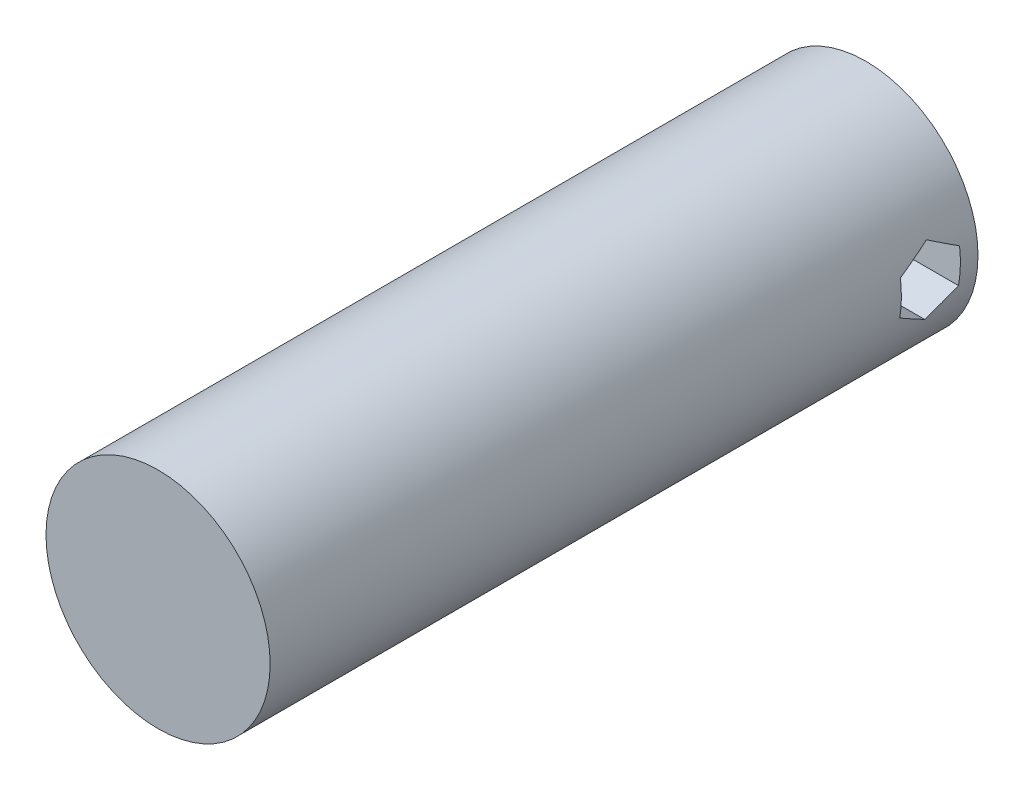
ISO-10303-21;
HEADER;
FILE_DESCRIPTION(('STEP AP214'),'2;1');
FILE_NAME('part.step','',(''),(''),'','','');
FILE_SCHEMA(('AUTOMOTIVE_DESIGN { 1 0 10303 214 1 1 1 1 }'));
ENDSEC;
DATA;
#1=APPLICATION_CONTEXT('core data for automotive mechanical design processes');
#2=APPLICATION_PROTOCOL_DEFINITION('international standard','automotive_design',2000,#1);
#3=PRODUCT_CONTEXT('',#1,'mechanical');
#4=PRODUCT('Part','Part','',(#3));
#5=PRODUCT_RELATED_PRODUCT_CATEGORY('part','',(#4));
#6=PRODUCT_DEFINITION_FORMATION('','',#4);
#7=PRODUCT_DEFINITION_CONTEXT('part definition',#1,'design');
#8=PRODUCT_DEFINITION('design','',#6,#7);
#9=PRODUCT_DEFINITION_SHAPE('','',#8);
#10=(LENGTH_UNIT() NAMED_UNIT(*) SI_UNIT(.MILLI.,.METRE.));
#11=(NAMED_UNIT(*) PLANE_ANGLE_UNIT() SI_UNIT($,.RADIAN.));
#12=(NAMED_UNIT(*) SI_UNIT($,.STERADIAN.) SOLID_ANGLE_UNIT());
#13=UNCERTAINTY_MEASURE_WITH_UNIT(LENGTH_MEASURE(1.E-05),#10,'distance_accuracy_value','');
#14=(GEOMETRIC_REPRESENTATION_CONTEXT(3) GLOBAL_UNCERTAINTY_ASSIGNED_CONTEXT((#13)) GLOBAL_UNIT_ASSIGNED_CONTEXT((#10,
#11,#12)) REPRESENTATION_CONTEXT('',''));
#15=CARTESIAN_POINT('',(0.,0.,0.));
#16=DIRECTION('',(0.,0.,1.));
#17=DIRECTION('',(1.,0.,0.));
#18=AXIS2_PLACEMENT_3D('',#15,#16,#17);
#19=CARTESIAN_POINT('',(0.,0.,30.));
#20=DIRECTION('',(0.,0.,-1.));
#21=DIRECTION('',(-1.,0.,0.));
#22=AXIS2_PLACEMENT_3D('',#19,#20,#21);
#23=CYLINDRICAL_SURFACE('',#22,4.75);
#24=CARTESIAN_POINT('',(0.,0.,-0.39249852163227));
#25=DIRECTION('',(0.,0.852659897031217,-0.522466362548552));
#26=DIRECTION('',(0.,-0.522466362548552,-0.852659897031217));
#27=AXIS2_PLACEMENT_3D('',#24,#25,#26);
#28=ELLIPSE('',#27,9.09149438220263,4.75);
#29=CARTESIAN_POINT('',(4.52554859875823,1.44288249011393,1.96227132316203));
#30=VERTEX_POINT('',#29);
#31=CARTESIAN_POINT('',(4.69979783309166,0.688767252464107,0.731562770466596));
#32=VERTEX_POINT('',#31);
#33=EDGE_CURVE('E108',#30,#32,#28,.T.);
#34=ORIENTED_EDGE('',*,*,#33,.T.);
#35=CARTESIAN_POINT('',(0.,0.,0.749572745126933));
#36=DIRECTION('',(0.,-0.0261391940742877,-0.999658312891533));
#37=DIRECTION('',(0.,0.999658312891534,-0.0261391940742877));
#38=AXIS2_PLACEMENT_3D('',#35,#36,#37);
#39=ELLIPSE('',#38,4.75162356851765,4.75);
#40=CARTESIAN_POINT('',(4.6897558793976,-0.754115237649827,0.769291447304571));
#41=VERTEX_POINT('',#40);
#42=EDGE_CURVE('E144',#32,#41,#39,.T.);
#43=ORIENTED_EDGE('',*,*,#42,.T.);
#44=CARTESIAN_POINT('',(0.,0.,-0.61949095977324));
#45=DIRECTION('',(0.,-0.878799091105505,-0.477191950342982));
#46=DIRECTION('',(0.,0.477191950342982,-0.878799091105505));
#47=AXIS2_PLACEMENT_3D('',#44,#45,#46);
#48=ELLIPSE('',#47,9.9540656471383,4.75);
#49=CARTESIAN_POINT('',(4.52554859875823,-1.44288249011393,2.03772867683797));
#50=VERTEX_POINT('',#49);
#51=EDGE_CURVE('E146',#41,#50,#48,.T.);
#52=ORIENTED_EDGE('',*,*,#51,.T.);
#53=CARTESIAN_POINT('',(0.,0.,4.39249852163227));
#54=DIRECTION('',(0.,-0.852659897031217,0.522466362548552));
#55=DIRECTION('',(0.,-0.522466362548552,-0.852659897031217));
#56=AXIS2_PLACEMENT_3D('',#53,#54,#55);
#57=ELLIPSE('',#56,9.09149438220263,4.75);
#58=CARTESIAN_POINT('',(4.69979783309166,-0.688767252464107,3.2684372295334));
#59=VERTEX_POINT('',#58);
#60=EDGE_CURVE('E149',#50,#59,#57,.T.);
#61=ORIENTED_EDGE('',*,*,#60,.T.);
#62=CARTESIAN_POINT('',(0.,0.,3.25042725487307));
#63=DIRECTION('',(0.,0.0261391940742878,0.999658312891533));
#64=DIRECTION('',(0.,0.999658312891533,-0.0261391940742878));
#65=AXIS2_PLACEMENT_3D('',#62,#63,#64);
#66=ELLIPSE('',#65,4.75162356851765,4.75);
#67=CARTESIAN_POINT('',(4.6897558793976,0.754115237649827,3.23070855269543));
#68=VERTEX_POINT('',#67);
#69=EDGE_CURVE('E152',#59,#68,#66,.T.);
#70=ORIENTED_EDGE('',*,*,#69,.T.);
#71=CARTESIAN_POINT('',(0.,0.,4.61949095977324));
#72=DIRECTION('',(0.,0.878799091105505,0.477191950342982));
#73=DIRECTION('',(0.,0.477191950342982,-0.878799091105505));
#74=AXIS2_PLACEMENT_3D('',#71,#72,#73);
#75=ELLIPSE('',#74,9.9540656471383,4.75);
#76=EDGE_CURVE('E135',#68,#30,#75,.T.);
#77=ORIENTED_EDGE('',*,*,#76,.T.);
#78=EDGE_LOOP('',(#34,#43,#52,#61,#70,#77));
#79=FACE_BOUND('',#78,.T.);
#80=CARTESIAN_POINT('',(0.,0.,30.));
#81=DIRECTION('',(0.,0.,1.));
#82=DIRECTION('',(1.,0.,0.));
#83=AXIS2_PLACEMENT_3D('',#80,#81,#82);
#84=CIRCLE('',#83,4.75);
#85=CARTESIAN_POINT('',(4.75,0.,30.));
#86=VERTEX_POINT('',#85);
#87=EDGE_CURVE('E11',#86,#86,#84,.T.);
#88=ORIENTED_EDGE('',*,*,#87,.F.);
#89=EDGE_LOOP('',(#88));
#90=FACE_BOUND('',#89,.T.);
#91=CARTESIAN_POINT('',(0.,0.,0.));
#92=DIRECTION('',(0.,0.,1.));
#93=DIRECTION('',(1.,0.,0.));
#94=AXIS2_PLACEMENT_3D('',#91,#92,#93);
#95=CIRCLE('',#94,4.75);
#96=CARTESIAN_POINT('',(4.75,0.,0.));
#97=VERTEX_POINT('',#96);
#98=EDGE_CURVE('E40',#97,#97,#95,.T.);
#99=ORIENTED_EDGE('',*,*,#98,.T.);
#100=EDGE_LOOP('',(#99));
#101=FACE_BOUND('',#100,.T.);
#102=ADVANCED_FACE('F37',(#79,#90,#101),#23,.T.);
#103=CARTESIAN_POINT('',(0.,0.,30.));
#104=DIRECTION('',(0.,0.,1.));
#105=DIRECTION('',(1.,0.,0.));
#106=AXIS2_PLACEMENT_3D('',#103,#104,#105);
#107=PLANE('',#106);
#108=ORIENTED_EDGE('',*,*,#87,.T.);
#109=EDGE_LOOP('',(#108));
#110=FACE_BOUND('',#109,.T.);
#111=ADVANCED_FACE('F191',(#110),#107,.T.);
#112=CARTESIAN_POINT('',(0.,0.,0.));
#113=DIRECTION('',(0.,0.,1.));
#114=DIRECTION('',(1.,0.,0.));
#115=AXIS2_PLACEMENT_3D('',#112,#113,#114);
#116=PLANE('',#115);
#117=DIRECTION('',(0.,-1.,0.));
#118=VECTOR('',#117,1.);
#119=CARTESIAN_POINT('',(0.94,1.53505700219894,0.));
#120=LINE('',#119,#118);
#121=CARTESIAN_POINT('',(0.94,1.53505700219894,0.));
#122=VERTEX_POINT('',#121);
#123=CARTESIAN_POINT('',(0.94,-1.53505700219894,0.));
#124=VERTEX_POINT('',#123);
#125=EDGE_CURVE('E159',#122,#124,#120,.T.);
#126=ORIENTED_EDGE('',*,*,#125,.F.);
#127=CARTESIAN_POINT('',(0.,0.,0.));
#128=DIRECTION('',(0.,0.,-1.));
#129=DIRECTION('',(-1.,0.,0.));
#130=AXIS2_PLACEMENT_3D('',#127,#128,#129);
#131=CIRCLE('',#130,1.8);
#132=EDGE_CURVE('E154',#124,#122,#131,.T.);
#133=ORIENTED_EDGE('',*,*,#132,.F.);
#134=EDGE_LOOP('',(#126,#133));
#135=FACE_BOUND('',#134,.T.);
#136=ORIENTED_EDGE('',*,*,#98,.F.);
#137=EDGE_LOOP('',(#136));
#138=FACE_BOUND('',#137,.T.);
#139=ADVANCED_FACE('F175',(#135,#138),#116,.F.);
#140=CARTESIAN_POINT('',(0.,0.,10.));
#141=DIRECTION('',(0.,0.,-1.));
#142=DIRECTION('',(-1.,0.,0.));
#143=AXIS2_PLACEMENT_3D('',#140,#141,#142);
#144=CYLINDRICAL_SURFACE('',#143,1.8);
#145=ORIENTED_EDGE('',*,*,#132,.T.);
#146=DIRECTION('',(0.,0.,-1.));
#147=VECTOR('',#146,1.);
#148=CARTESIAN_POINT('',(0.94,1.53505700219894,10.));
#149=LINE('',#148,#147);
#150=CARTESIAN_POINT('',(0.94,1.53505700219894,10.));
#151=VERTEX_POINT('',#150);
#152=EDGE_CURVE('E162',#151,#122,#149,.T.);
#153=ORIENTED_EDGE('',*,*,#152,.F.);
#154=CARTESIAN_POINT('',(0.,0.,10.));
#155=DIRECTION('',(0.,0.,-1.));
#156=DIRECTION('',(-1.,0.,0.));
#157=AXIS2_PLACEMENT_3D('',#154,#155,#156);
#158=CIRCLE('',#157,1.8);
#159=CARTESIAN_POINT('',(0.94,-1.53505700219894,10.));
#160=VERTEX_POINT('',#159);
#161=EDGE_CURVE('E155',#160,#151,#158,.T.);
#162=ORIENTED_EDGE('',*,*,#161,.F.);
#163=DIRECTION('',(0.,0.,-1.));
#164=VECTOR('',#163,1.);
#165=CARTESIAN_POINT('',(0.94,-1.53505700219894,10.));
#166=LINE('',#165,#164);
#167=EDGE_CURVE('E166',#160,#124,#166,.T.);
#168=ORIENTED_EDGE('',*,*,#167,.T.);
#169=EDGE_LOOP('',(#145,#153,#162,#168));
#170=FACE_BOUND('',#169,.T.);
#171=ADVANCED_FACE('F177',(#170),#144,.F.);
#172=CARTESIAN_POINT('',(0.94,1.53505700219894,10.));
#173=DIRECTION('',(1.,0.,0.));
#174=DIRECTION('',(0.,0.,-1.));
#175=AXIS2_PLACEMENT_3D('',#172,#173,#174);
#176=PLANE('',#175);
#177=DIRECTION('',(0.,0.477191950342982,-0.878799091105505));
#178=VECTOR('',#177,1.);
#179=CARTESIAN_POINT('',(0.94,0.754115237649827,3.23070855269543));
#180=LINE('',#179,#178);
#181=CARTESIAN_POINT('',(0.94,0.754115237649827,3.23070855269543));
#182=VERTEX_POINT('',#181);
#183=CARTESIAN_POINT('',(0.94,1.44288249011393,1.96227132316203));
#184=VERTEX_POINT('',#183);
#185=EDGE_CURVE('E114',#182,#184,#180,.T.);
#186=ORIENTED_EDGE('',*,*,#185,.F.);
#187=DIRECTION('',(0.,0.999658312891533,-0.0261391940742878));
#188=VECTOR('',#187,1.);
#189=CARTESIAN_POINT('',(0.94,-0.688767252464107,3.2684372295334));
#190=LINE('',#189,#188);
#191=CARTESIAN_POINT('',(0.94,-0.688767252464107,3.2684372295334));
#192=VERTEX_POINT('',#191);
#193=EDGE_CURVE('E59',#192,#182,#190,.T.);
#194=ORIENTED_EDGE('',*,*,#193,.F.);
#195=DIRECTION('',(0.,0.522466362548552,0.852659897031217));
#196=VECTOR('',#195,1.);
#197=CARTESIAN_POINT('',(0.94,-1.44288249011393,2.03772867683797));
#198=LINE('',#197,#196);
#199=CARTESIAN_POINT('',(0.94,-1.44288249011393,2.03772867683797));
#200=VERTEX_POINT('',#199);
#201=EDGE_CURVE('E130',#200,#192,#198,.T.);
#202=ORIENTED_EDGE('',*,*,#201,.F.);
#203=DIRECTION('',(0.,-0.477191950342982,0.878799091105505));
#204=VECTOR('',#203,1.);
#205=CARTESIAN_POINT('',(0.94,-0.754115237649827,0.769291447304571));
#206=LINE('',#205,#204);
#207=CARTESIAN_POINT('',(0.94,-0.754115237649827,0.769291447304571));
#208=VERTEX_POINT('',#207);
#209=EDGE_CURVE('E124',#208,#200,#206,.T.);
#210=ORIENTED_EDGE('',*,*,#209,.F.);
#211=DIRECTION('',(0.,-0.999658312891533,0.0261391940742877));
#212=VECTOR('',#211,1.);
#213=CARTESIAN_POINT('',(0.94,0.688767252464107,0.731562770466596));
#214=LINE('',#213,#212);
#215=CARTESIAN_POINT('',(0.94,0.688767252464107,0.731562770466596));
#216=VERTEX_POINT('',#215);
#217=EDGE_CURVE('E122',#216,#208,#214,.T.);
#218=ORIENTED_EDGE('',*,*,#217,.F.);
#219=DIRECTION('',(0.,-0.522466362548552,-0.852659897031217));
#220=VECTOR('',#219,1.);
#221=CARTESIAN_POINT('',(0.94,1.44288249011393,1.96227132316203));
#222=LINE('',#221,#220);
#223=EDGE_CURVE('E105',#184,#216,#222,.T.);
#224=ORIENTED_EDGE('',*,*,#223,.F.);
#225=EDGE_LOOP('',(#186,#194,#202,#210,#218,#224));
#226=FACE_BOUND('',#225,.T.);
#227=ORIENTED_EDGE('',*,*,#125,.T.);
#228=ORIENTED_EDGE('',*,*,#167,.F.);
#229=DIRECTION('',(0.,-1.,0.));
#230=VECTOR('',#229,1.);
#231=CARTESIAN_POINT('',(0.94,1.53505700219894,10.));
#232=LINE('',#231,#230);
#233=EDGE_CURVE('E158',#151,#160,#232,.T.);
#234=ORIENTED_EDGE('',*,*,#233,.F.);
#235=ORIENTED_EDGE('',*,*,#152,.T.);
#236=EDGE_LOOP('',(#227,#228,#234,#235));
#237=FACE_BOUND('',#236,.T.);
#238=ADVANCED_FACE('F118',(#226,#237),#176,.F.);
#239=CARTESIAN_POINT('',(0.,0.,10.));
#240=DIRECTION('',(0.,0.,-1.));
#241=DIRECTION('',(-1.,0.,0.));
#242=AXIS2_PLACEMENT_3D('',#239,#240,#241);
#243=PLANE('',#242);
#244=ORIENTED_EDGE('',*,*,#161,.T.);
#245=ORIENTED_EDGE('',*,*,#233,.T.);
#246=EDGE_LOOP('',(#244,#245));
#247=FACE_BOUND('',#246,.T.);
#248=ADVANCED_FACE('F179',(#247),#243,.T.);
#249=CARTESIAN_POINT('',(4.75,-0.688767252464107,3.2684372295334));
#250=DIRECTION('',(0.,0.0261391940742878,0.999658312891533));
#251=DIRECTION('',(0.,-0.999658312891534,0.0261391940742879));
#252=AXIS2_PLACEMENT_3D('',#249,#250,#251);
#253=PLANE('',#252);
#254=DIRECTION('',(-1.,0.,0.));
#255=VECTOR('',#254,1.);
#256=CARTESIAN_POINT('',(4.75,-0.688767252464107,3.2684372295334));
#257=LINE('',#256,#255);
#258=EDGE_CURVE('E133',#59,#192,#257,.T.);
#259=ORIENTED_EDGE('',*,*,#258,.T.);
#260=ORIENTED_EDGE('',*,*,#193,.T.);
#261=DIRECTION('',(-1.,0.,0.));
#262=VECTOR('',#261,1.);
#263=CARTESIAN_POINT('',(4.75,0.754115237649827,3.23070855269543));
#264=LINE('',#263,#262);
#265=EDGE_CURVE('E111',#68,#182,#264,.T.);
#266=ORIENTED_EDGE('',*,*,#265,.F.);
#267=ORIENTED_EDGE('',*,*,#69,.F.);
#268=EDGE_LOOP('',(#259,#260,#266,#267));
#269=FACE_BOUND('',#268,.T.);
#270=ADVANCED_FACE('F181',(#269),#253,.F.);
#271=CARTESIAN_POINT('',(4.75,-1.44288249011393,2.03772867683797));
#272=DIRECTION('',(0.,-0.852659897031217,0.522466362548552));
#273=DIRECTION('',(0.,-0.522466362548552,-0.852659897031217));
#274=AXIS2_PLACEMENT_3D('',#271,#272,#273);
#275=PLANE('',#274);
#276=DIRECTION('',(-1.,0.,0.));
#277=VECTOR('',#276,1.);
#278=CARTESIAN_POINT('',(4.75,-1.44288249011393,2.03772867683797));
#279=LINE('',#278,#277);
#280=EDGE_CURVE('E136',#50,#200,#279,.T.);
#281=ORIENTED_EDGE('',*,*,#280,.T.);
#282=ORIENTED_EDGE('',*,*,#201,.T.);
#283=ORIENTED_EDGE('',*,*,#258,.F.);
#284=ORIENTED_EDGE('',*,*,#60,.F.);
#285=EDGE_LOOP('',(#281,#282,#283,#284));
#286=FACE_BOUND('',#285,.T.);
#287=ADVANCED_FACE('F187',(#286),#275,.F.);
#288=CARTESIAN_POINT('',(4.75,-0.754115237649827,0.769291447304571));
#289=DIRECTION('',(0.,-0.878799091105505,-0.477191950342982));
#290=DIRECTION('',(0.,0.477191950342982,-0.878799091105505));
#291=AXIS2_PLACEMENT_3D('',#288,#289,#290);
#292=PLANE('',#291);
#293=DIRECTION('',(-1.,0.,0.));
#294=VECTOR('',#293,1.);
#295=CARTESIAN_POINT('',(4.75,-0.754115237649827,0.769291447304571));
#296=LINE('',#295,#294);
#297=EDGE_CURVE('E138',#41,#208,#296,.T.);
#298=ORIENTED_EDGE('',*,*,#297,.T.);
#299=ORIENTED_EDGE('',*,*,#209,.T.);
#300=ORIENTED_EDGE('',*,*,#280,.F.);
#301=ORIENTED_EDGE('',*,*,#51,.F.);
#302=EDGE_LOOP('',(#298,#299,#300,#301));
#303=FACE_BOUND('',#302,.T.);
#304=ADVANCED_FACE('F234',(#303),#292,.F.);
#305=CARTESIAN_POINT('',(4.75,0.688767252464107,0.731562770466596));
#306=DIRECTION('',(0.,-0.0261391940742877,-0.999658312891533));
#307=DIRECTION('',(0.,0.999658312891534,-0.0261391940742877));
#308=AXIS2_PLACEMENT_3D('',#305,#306,#307);
#309=PLANE('',#308);
#310=DIRECTION('',(-1.,0.,0.));
#311=VECTOR('',#310,1.);
#312=CARTESIAN_POINT('',(4.75,0.688767252464107,0.731562770466596));
#313=LINE('',#312,#311);
#314=EDGE_CURVE('E110',#32,#216,#313,.T.);
#315=ORIENTED_EDGE('',*,*,#314,.T.);
#316=ORIENTED_EDGE('',*,*,#217,.T.);
#317=ORIENTED_EDGE('',*,*,#297,.F.);
#318=ORIENTED_EDGE('',*,*,#42,.F.);
#319=EDGE_LOOP('',(#315,#316,#317,#318));
#320=FACE_BOUND('',#319,.T.);
#321=ADVANCED_FACE('F245',(#320),#309,.F.);
#322=CARTESIAN_POINT('',(4.75,1.44288249011393,1.96227132316203));
#323=DIRECTION('',(0.,0.852659897031217,-0.522466362548552));
#324=DIRECTION('',(0.,0.522466362548552,0.852659897031217));
#325=AXIS2_PLACEMENT_3D('',#322,#323,#324);
#326=PLANE('',#325);
#327=DIRECTION('',(-1.,0.,0.));
#328=VECTOR('',#327,1.);
#329=CARTESIAN_POINT('',(4.75,1.44288249011393,1.96227132316203));
#330=LINE('',#329,#328);
#331=EDGE_CURVE('E51',#30,#184,#330,.T.);
#332=ORIENTED_EDGE('',*,*,#331,.T.);
#333=ORIENTED_EDGE('',*,*,#223,.T.);
#334=ORIENTED_EDGE('',*,*,#314,.F.);
#335=ORIENTED_EDGE('',*,*,#33,.F.);
#336=EDGE_LOOP('',(#332,#333,#334,#335));
#337=FACE_BOUND('',#336,.T.);
#338=ADVANCED_FACE('F102',(#337),#326,.F.);
#339=CARTESIAN_POINT('',(4.75,0.754115237649827,3.23070855269543));
#340=DIRECTION('',(0.,0.878799091105505,0.477191950342982));
#341=DIRECTION('',(0.,-0.477191950342982,0.878799091105505));
#342=AXIS2_PLACEMENT_3D('',#339,#340,#341);
#343=PLANE('',#342);
#344=ORIENTED_EDGE('',*,*,#265,.T.);
#345=ORIENTED_EDGE('',*,*,#185,.T.);
#346=ORIENTED_EDGE('',*,*,#331,.F.);
#347=ORIENTED_EDGE('',*,*,#76,.F.);
#348=EDGE_LOOP('',(#344,#345,#346,#347));
#349=FACE_BOUND('',#348,.T.);
#350=ADVANCED_FACE('F115',(#349),#343,.F.);
#351=CLOSED_SHELL('',(#102,#111,#139,#171,#238,#248,#270,#287,#304,#321,#338,#350));
#352=MANIFOLD_SOLID_BREP('B2',#351);
#353=ADVANCED_BREP_SHAPE_REPRESENTATION('',(#18,#352),#14);
#354=SHAPE_DEFINITION_REPRESENTATION(#9,#353);
ENDSEC;
END-ISO-10303-21;
